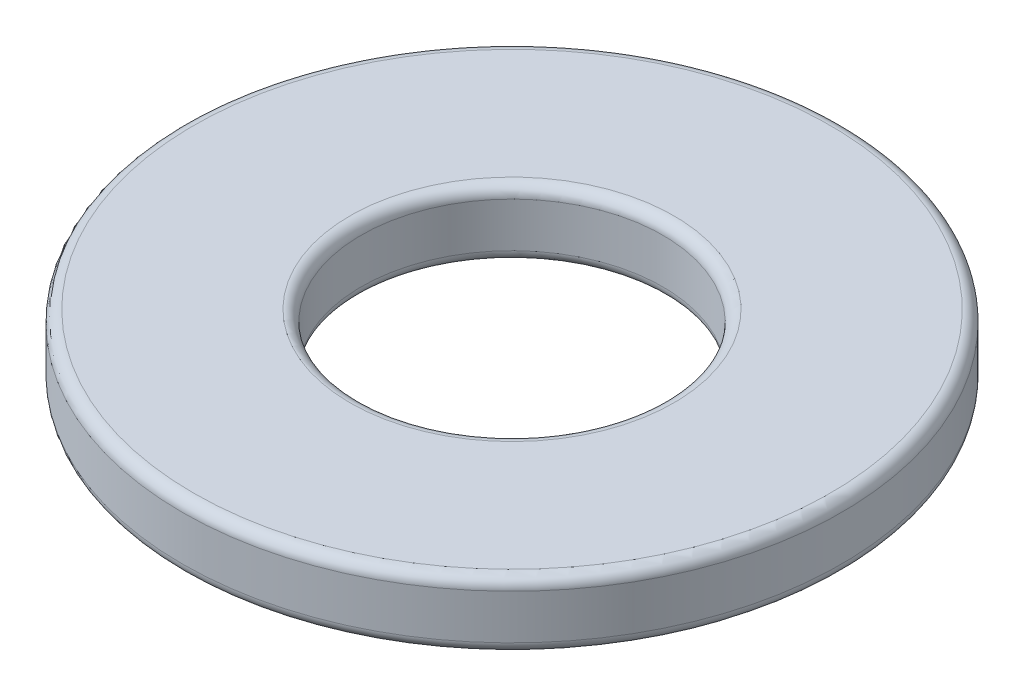
ISO-10303-21;
HEADER;
FILE_DESCRIPTION(('STEP AP214'),'2;1');
FILE_NAME('part.step','',(''),(''),'','','');
FILE_SCHEMA(('AUTOMOTIVE_DESIGN { 1 0 10303 214 1 1 1 1 }'));
ENDSEC;
DATA;
#1=APPLICATION_CONTEXT('core data for automotive mechanical design processes');
#2=APPLICATION_PROTOCOL_DEFINITION('international standard','automotive_design',2000,#1);
#3=PRODUCT_CONTEXT('',#1,'mechanical');
#4=PRODUCT('Part','Part','',(#3));
#5=PRODUCT_RELATED_PRODUCT_CATEGORY('part','',(#4));
#6=PRODUCT_DEFINITION_FORMATION('','',#4);
#7=PRODUCT_DEFINITION_CONTEXT('part definition',#1,'design');
#8=PRODUCT_DEFINITION('design','',#6,#7);
#9=PRODUCT_DEFINITION_SHAPE('','',#8);
#10=(LENGTH_UNIT() NAMED_UNIT(*) SI_UNIT(.MILLI.,.METRE.));
#11=(NAMED_UNIT(*) PLANE_ANGLE_UNIT() SI_UNIT($,.RADIAN.));
#12=(NAMED_UNIT(*) SI_UNIT($,.STERADIAN.) SOLID_ANGLE_UNIT());
#13=UNCERTAINTY_MEASURE_WITH_UNIT(LENGTH_MEASURE(1.E-05),#10,'distance_accuracy_value','');
#14=(GEOMETRIC_REPRESENTATION_CONTEXT(3) GLOBAL_UNCERTAINTY_ASSIGNED_CONTEXT((#13)) GLOBAL_UNIT_ASSIGNED_CONTEXT((#10,
#11,#12)) REPRESENTATION_CONTEXT('',''));
#15=CARTESIAN_POINT('',(0.,0.,0.));
#16=DIRECTION('',(0.,0.,1.));
#17=DIRECTION('',(1.,0.,0.));
#18=AXIS2_PLACEMENT_3D('',#15,#16,#17);
#19=CARTESIAN_POINT('',(0.,1.2,0.));
#20=DIRECTION('',(0.,1.,0.));
#21=DIRECTION('',(0.,0.,1.));
#22=AXIS2_PLACEMENT_3D('',#19,#20,#21);
#23=PLANE('',#22);
#24=CARTESIAN_POINT('',(0.,1.2,0.));
#25=DIRECTION('',(0.,1.,0.));
#26=DIRECTION('',(0.,0.,1.));
#27=AXIS2_PLACEMENT_3D('',#24,#25,#26);
#28=CIRCLE('',#27,2.9);
#29=CARTESIAN_POINT('',(0.,1.2,2.9));
#30=VERTEX_POINT('',#29);
#31=EDGE_CURVE('E44',#30,#30,#28,.F.);
#32=ORIENTED_EDGE('',*,*,#31,.T.);
#33=EDGE_LOOP('',(#32));
#34=FACE_BOUND('',#33,.T.);
#35=CARTESIAN_POINT('',(0.,1.2,0.));
#36=DIRECTION('',(0.,1.,0.));
#37=DIRECTION('',(0.,0.,1.));
#38=AXIS2_PLACEMENT_3D('',#35,#36,#37);
#39=CIRCLE('',#38,5.7);
#40=CARTESIAN_POINT('',(0.,1.2,5.7));
#41=VERTEX_POINT('',#40);
#42=EDGE_CURVE('E48',#41,#41,#39,.T.);
#43=ORIENTED_EDGE('',*,*,#42,.T.);
#44=EDGE_LOOP('',(#43));
#45=FACE_BOUND('',#44,.T.);
#46=ADVANCED_FACE('F33',(#34,#45),#23,.T.);
#47=CARTESIAN_POINT('',(0.,0.,0.));
#48=DIRECTION('',(0.,1.,0.));
#49=DIRECTION('',(0.,0.,1.));
#50=AXIS2_PLACEMENT_3D('',#47,#48,#49);
#51=PLANE('',#50);
#52=CARTESIAN_POINT('',(0.,0.,0.));
#53=DIRECTION('',(0.,1.,0.));
#54=DIRECTION('',(0.,0.,1.));
#55=AXIS2_PLACEMENT_3D('',#52,#53,#54);
#56=CIRCLE('',#55,2.9);
#57=CARTESIAN_POINT('',(0.,0.,2.9));
#58=VERTEX_POINT('',#57);
#59=EDGE_CURVE('E59',#58,#58,#56,.T.);
#60=ORIENTED_EDGE('',*,*,#59,.T.);
#61=EDGE_LOOP('',(#60));
#62=FACE_BOUND('',#61,.T.);
#63=CARTESIAN_POINT('',(0.,0.,0.));
#64=DIRECTION('',(0.,1.,0.));
#65=DIRECTION('',(0.,0.,1.));
#66=AXIS2_PLACEMENT_3D('',#63,#64,#65);
#67=CIRCLE('',#66,5.7);
#68=CARTESIAN_POINT('',(0.,0.,5.7));
#69=VERTEX_POINT('',#68);
#70=EDGE_CURVE('E62',#69,#69,#67,.F.);
#71=ORIENTED_EDGE('',*,*,#70,.T.);
#72=EDGE_LOOP('',(#71));
#73=FACE_BOUND('',#72,.T.);
#74=ADVANCED_FACE('F66',(#62,#73),#51,.F.);
#75=CARTESIAN_POINT('',(0.,1.2,0.));
#76=DIRECTION('',(0.,-1.,0.));
#77=DIRECTION('',(0.,0.,-1.));
#78=AXIS2_PLACEMENT_3D('',#75,#76,#77);
#79=CYLINDRICAL_SURFACE('',#78,5.9);
#80=CARTESIAN_POINT('',(0.,0.2,0.));
#81=DIRECTION('',(0.,1.,0.));
#82=DIRECTION('',(0.,0.,1.));
#83=AXIS2_PLACEMENT_3D('',#80,#81,#82);
#84=CIRCLE('',#83,5.9);
#85=CARTESIAN_POINT('',(0.,0.2,5.9));
#86=VERTEX_POINT('',#85);
#87=EDGE_CURVE('E10',#86,#86,#84,.T.);
#88=ORIENTED_EDGE('',*,*,#87,.T.);
#89=EDGE_LOOP('',(#88));
#90=FACE_BOUND('',#89,.T.);
#91=CARTESIAN_POINT('',(0.,1.,0.));
#92=DIRECTION('',(0.,1.,0.));
#93=DIRECTION('',(0.,0.,1.));
#94=AXIS2_PLACEMENT_3D('',#91,#92,#93);
#95=CIRCLE('',#94,5.9);
#96=CARTESIAN_POINT('',(0.,1.,5.9));
#97=VERTEX_POINT('',#96);
#98=EDGE_CURVE('E40',#97,#97,#95,.F.);
#99=ORIENTED_EDGE('',*,*,#98,.T.);
#100=EDGE_LOOP('',(#99));
#101=FACE_BOUND('',#100,.T.);
#102=ADVANCED_FACE('F86',(#90,#101),#79,.T.);
#103=CARTESIAN_POINT('',(0.,1.2,0.));
#104=DIRECTION('',(0.,-1.,0.));
#105=DIRECTION('',(0.,0.,-1.));
#106=AXIS2_PLACEMENT_3D('',#103,#104,#105);
#107=CYLINDRICAL_SURFACE('',#106,2.7);
#108=CARTESIAN_POINT('',(0.,0.2,0.));
#109=DIRECTION('',(0.,1.,0.));
#110=DIRECTION('',(0.,0.,1.));
#111=AXIS2_PLACEMENT_3D('',#108,#109,#110);
#112=CIRCLE('',#111,2.7);
#113=CARTESIAN_POINT('',(0.,0.2,2.7));
#114=VERTEX_POINT('',#113);
#115=EDGE_CURVE('E53',#114,#114,#112,.F.);
#116=ORIENTED_EDGE('',*,*,#115,.T.);
#117=EDGE_LOOP('',(#116));
#118=FACE_BOUND('',#117,.T.);
#119=CARTESIAN_POINT('',(0.,1.,0.));
#120=DIRECTION('',(0.,1.,0.));
#121=DIRECTION('',(0.,0.,1.));
#122=AXIS2_PLACEMENT_3D('',#119,#120,#121);
#123=CIRCLE('',#122,2.7);
#124=CARTESIAN_POINT('',(0.,1.,2.7));
#125=VERTEX_POINT('',#124);
#126=EDGE_CURVE('E56',#125,#125,#123,.T.);
#127=ORIENTED_EDGE('',*,*,#126,.T.);
#128=EDGE_LOOP('',(#127));
#129=FACE_BOUND('',#128,.T.);
#130=ADVANCED_FACE('F91',(#118,#129),#107,.F.);
#131=CARTESIAN_POINT('',(0.,0.2,0.));
#132=DIRECTION('',(0.,1.,0.));
#133=DIRECTION('',(0.,0.,1.));
#134=AXIS2_PLACEMENT_3D('',#131,#132,#133);
#135=TOROIDAL_SURFACE('',#134,2.9,0.2);
#136=ORIENTED_EDGE('',*,*,#115,.F.);
#137=EDGE_LOOP('',(#136));
#138=FACE_BOUND('',#137,.T.);
#139=ORIENTED_EDGE('',*,*,#59,.F.);
#140=EDGE_LOOP('',(#139));
#141=FACE_BOUND('',#140,.T.);
#142=ADVANCED_FACE('F77',(#138,#141),#135,.T.);
#143=CARTESIAN_POINT('',(0.,1.,0.));
#144=DIRECTION('',(0.,1.,0.));
#145=DIRECTION('',(0.,0.,1.));
#146=AXIS2_PLACEMENT_3D('',#143,#144,#145);
#147=TOROIDAL_SURFACE('',#146,2.9,0.2);
#148=ORIENTED_EDGE('',*,*,#31,.F.);
#149=EDGE_LOOP('',(#148));
#150=FACE_BOUND('',#149,.T.);
#151=ORIENTED_EDGE('',*,*,#126,.F.);
#152=EDGE_LOOP('',(#151));
#153=FACE_BOUND('',#152,.T.);
#154=ADVANCED_FACE('F71',(#150,#153),#147,.T.);
#155=CARTESIAN_POINT('',(0.,0.2,0.));
#156=DIRECTION('',(0.,1.,0.));
#157=DIRECTION('',(0.,0.,1.));
#158=AXIS2_PLACEMENT_3D('',#155,#156,#157);
#159=TOROIDAL_SURFACE('',#158,5.7,0.2);
#160=ORIENTED_EDGE('',*,*,#70,.F.);
#161=EDGE_LOOP('',(#160));
#162=FACE_BOUND('',#161,.T.);
#163=ORIENTED_EDGE('',*,*,#87,.F.);
#164=EDGE_LOOP('',(#163));
#165=FACE_BOUND('',#164,.T.);
#166=ADVANCED_FACE('F68',(#162,#165),#159,.T.);
#167=CARTESIAN_POINT('',(0.,1.,0.));
#168=DIRECTION('',(0.,1.,0.));
#169=DIRECTION('',(0.,0.,1.));
#170=AXIS2_PLACEMENT_3D('',#167,#168,#169);
#171=TOROIDAL_SURFACE('',#170,5.7,0.2);
#172=ORIENTED_EDGE('',*,*,#98,.F.);
#173=EDGE_LOOP('',(#172));
#174=FACE_BOUND('',#173,.T.);
#175=ORIENTED_EDGE('',*,*,#42,.F.);
#176=EDGE_LOOP('',(#175));
#177=FACE_BOUND('',#176,.T.);
#178=ADVANCED_FACE('F35',(#174,#177),#171,.T.);
#179=CLOSED_SHELL('',(#46,#74,#102,#130,#142,#154,#166,#178));
#180=MANIFOLD_SOLID_BREP('B2',#179);
#181=ADVANCED_BREP_SHAPE_REPRESENTATION('',(#18,#180),#14);
#182=SHAPE_DEFINITION_REPRESENTATION(#9,#181);
ENDSEC;
END-ISO-10303-21;
